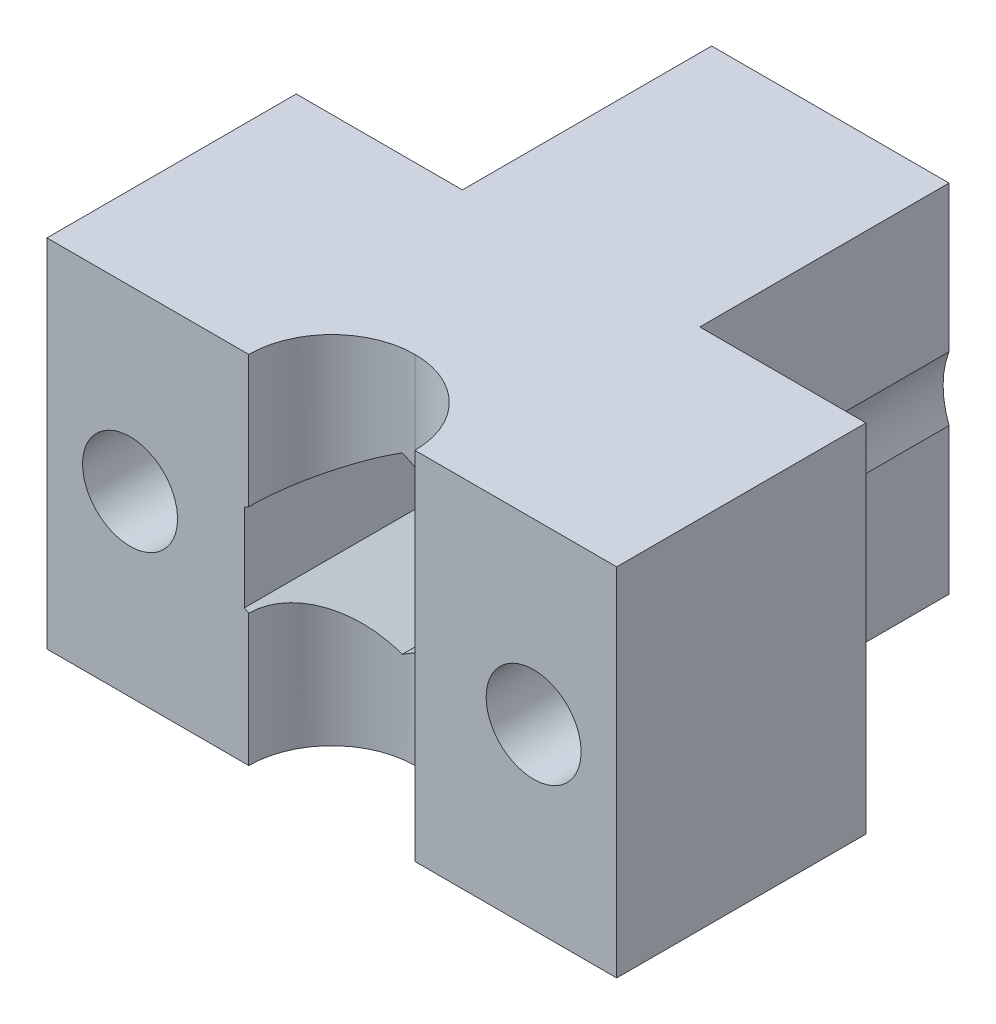
ISO-10303-21;
HEADER;
FILE_DESCRIPTION(('STEP AP214'),'2;1');
FILE_NAME('part.step','',(''),(''),'','','');
FILE_SCHEMA(('AUTOMOTIVE_DESIGN { 1 0 10303 214 1 1 1 1 }'));
ENDSEC;
DATA;
#1=APPLICATION_CONTEXT('core data for automotive mechanical design processes');
#2=APPLICATION_PROTOCOL_DEFINITION('international standard','automotive_design',2000,#1);
#3=PRODUCT_CONTEXT('',#1,'mechanical');
#4=PRODUCT('Part','Part','',(#3));
#5=PRODUCT_RELATED_PRODUCT_CATEGORY('part','',(#4));
#6=PRODUCT_DEFINITION_FORMATION('','',#4);
#7=PRODUCT_DEFINITION_CONTEXT('part definition',#1,'design');
#8=PRODUCT_DEFINITION('design','',#6,#7);
#9=PRODUCT_DEFINITION_SHAPE('','',#8);
#10=(LENGTH_UNIT() NAMED_UNIT(*) SI_UNIT(.MILLI.,.METRE.));
#11=(NAMED_UNIT(*) PLANE_ANGLE_UNIT() SI_UNIT($,.RADIAN.));
#12=(NAMED_UNIT(*) SI_UNIT($,.STERADIAN.) SOLID_ANGLE_UNIT());
#13=UNCERTAINTY_MEASURE_WITH_UNIT(LENGTH_MEASURE(1.E-05),#10,'distance_accuracy_value','');
#14=(GEOMETRIC_REPRESENTATION_CONTEXT(3) GLOBAL_UNCERTAINTY_ASSIGNED_CONTEXT((#13)) GLOBAL_UNIT_ASSIGNED_CONTEXT((#10,
#11,#12)) REPRESENTATION_CONTEXT('',''));
#15=CARTESIAN_POINT('',(0.,0.,0.));
#16=DIRECTION('',(0.,0.,1.));
#17=DIRECTION('',(1.,0.,0.));
#18=AXIS2_PLACEMENT_3D('',#15,#16,#17);
#19=CARTESIAN_POINT('',(0.,0.,10.));
#20=DIRECTION('',(0.,-1.,0.));
#21=DIRECTION('',(1.,0.,0.));
#22=AXIS2_PLACEMENT_3D('',#19,#20,#21);
#23=CYLINDRICAL_SURFACE('',#22,7.);
#24=CARTESIAN_POINT('',(0.,8.22735026918962,10.));
#25=DIRECTION('',(0.5,-0.866025403784439,0.));
#26=DIRECTION('',(-0.866025403784439,-0.5,0.));
#27=AXIS2_PLACEMENT_3D('',#24,#25,#26);
#28=ELLIPSE('',#27,8.08290376865476,7.);
#29=CARTESIAN_POINT('',(0.,8.22735026918962,3.));
#30=VERTEX_POINT('',#29);
#31=CARTESIAN_POINT('',(-1.,7.65,3.07179676972449));
#32=VERTEX_POINT('',#31);
#33=EDGE_CURVE('E456',#30,#32,#28,.F.);
#34=ORIENTED_EDGE('',*,*,#33,.T.);
#35=CARTESIAN_POINT('',(0.,7.07264973081037,10.));
#36=DIRECTION('',(-0.5,-0.866025403784439,0.));
#37=DIRECTION('',(0.866025403784439,-0.5,0.));
#38=AXIS2_PLACEMENT_3D('',#35,#36,#37);
#39=ELLIPSE('',#38,8.08290376865476,7.);
#40=CARTESIAN_POINT('',(-7.,11.1141016151378,10.));
#41=VERTEX_POINT('',#40);
#42=EDGE_CURVE('E459',#32,#41,#39,.F.);
#43=ORIENTED_EDGE('',*,*,#42,.T.);
#44=DIRECTION('',(0.,-1.,0.));
#45=VECTOR('',#44,1.);
#46=CARTESIAN_POINT('',(-7.00000000000001,30.,10.));
#47=LINE('',#46,#45);
#48=CARTESIAN_POINT('',(-7.,0.,10.));
#49=VERTEX_POINT('',#48);
#50=EDGE_CURVE('E394',#41,#49,#47,.T.);
#51=ORIENTED_EDGE('',*,*,#50,.T.);
#52=CARTESIAN_POINT('',(0.,0.,10.));
#53=DIRECTION('',(0.,-1.,0.));
#54=DIRECTION('',(0.,0.,-1.));
#55=AXIS2_PLACEMENT_3D('',#52,#53,#54);
#56=CIRCLE('',#55,7.);
#57=CARTESIAN_POINT('',(0.,0.,3.));
#58=VERTEX_POINT('',#57);
#59=EDGE_CURVE('E426',#58,#49,#56,.F.);
#60=ORIENTED_EDGE('',*,*,#59,.F.);
#61=DIRECTION('',(0.,1.,0.));
#62=VECTOR('',#61,1.);
#63=CARTESIAN_POINT('',(0.,0.,3.));
#64=LINE('',#63,#62);
#65=EDGE_CURVE('E320',#58,#30,#64,.T.);
#66=ORIENTED_EDGE('',*,*,#65,.T.);
#67=EDGE_LOOP('',(#34,#43,#51,#60,#66));
#68=FACE_BOUND('',#67,.T.);
#69=ADVANCED_FACE('F37',(#68),#23,.F.);
#70=CARTESIAN_POINT('',(-10.,0.,0.));
#71=DIRECTION('',(1.,0.,0.));
#72=DIRECTION('',(0.,0.,-1.));
#73=AXIS2_PLACEMENT_3D('',#70,#71,#72);
#74=PLANE('',#73);
#75=DIRECTION('',(0.,0.,1.));
#76=VECTOR('',#75,1.);
#77=CARTESIAN_POINT('',(-10.,17.6925824035673,-32.));
#78=LINE('',#77,#76);
#79=CARTESIAN_POINT('',(-10.,17.6925824035673,-11.));
#80=VERTEX_POINT('',#79);
#81=CARTESIAN_POINT('',(-10.,17.6925824035673,-16.4));
#82=VERTEX_POINT('',#81);
#83=EDGE_CURVE('E450',#80,#82,#78,.F.);
#84=ORIENTED_EDGE('',*,*,#83,.F.);
#85=DIRECTION('',(0.,1.,0.));
#86=VECTOR('',#85,1.);
#87=CARTESIAN_POINT('',(-10.,0.,-11.));
#88=LINE('',#87,#86);
#89=CARTESIAN_POINT('',(-10.,30.,-11.));
#90=VERTEX_POINT('',#89);
#91=EDGE_CURVE('E354',#80,#90,#88,.T.);
#92=ORIENTED_EDGE('',*,*,#91,.T.);
#93=DIRECTION('',(0.,0.,-1.));
#94=VECTOR('',#93,1.);
#95=CARTESIAN_POINT('',(-10.,30.,-11.));
#96=LINE('',#95,#94);
#97=CARTESIAN_POINT('',(-10.,30.,-32.));
#98=VERTEX_POINT('',#97);
#99=EDGE_CURVE('E358',#90,#98,#96,.T.);
#100=ORIENTED_EDGE('',*,*,#99,.T.);
#101=DIRECTION('',(0.,-1.,0.));
#102=VECTOR('',#101,1.);
#103=CARTESIAN_POINT('',(-10.,0.,-32.));
#104=LINE('',#103,#102);
#105=CARTESIAN_POINT('',(-10.,17.6925824035673,-32.));
#106=VERTEX_POINT('',#105);
#107=EDGE_CURVE('E361',#98,#106,#104,.T.);
#108=ORIENTED_EDGE('',*,*,#107,.T.);
#109=CARTESIAN_POINT('',(-10.,17.6925824035673,-26.6));
#110=VERTEX_POINT('',#109);
#111=EDGE_CURVE('E448',#110,#106,#78,.F.);
#112=ORIENTED_EDGE('',*,*,#111,.F.);
#113=DIRECTION('',(0.,-1.,0.));
#114=VECTOR('',#113,1.);
#115=CARTESIAN_POINT('',(-10.,4.9,-26.6));
#116=LINE('',#115,#114);
#117=CARTESIAN_POINT('',(-10.,25.1,-26.6));
#118=VERTEX_POINT('',#117);
#119=EDGE_CURVE('E337',#118,#110,#116,.T.);
#120=ORIENTED_EDGE('',*,*,#119,.F.);
#121=DIRECTION('',(0.,0.,-1.));
#122=VECTOR('',#121,1.);
#123=CARTESIAN_POINT('',(-10.,25.1,-16.4));
#124=LINE('',#123,#122);
#125=CARTESIAN_POINT('',(-10.,25.1,-16.4));
#126=VERTEX_POINT('',#125);
#127=EDGE_CURVE('E333',#126,#118,#124,.T.);
#128=ORIENTED_EDGE('',*,*,#127,.F.);
#129=DIRECTION('',(0.,1.,0.));
#130=VECTOR('',#129,1.);
#131=CARTESIAN_POINT('',(-10.,4.9,-16.4));
#132=LINE('',#131,#130);
#133=EDGE_CURVE('E329',#82,#126,#132,.T.);
#134=ORIENTED_EDGE('',*,*,#133,.F.);
#135=EDGE_LOOP('',(#84,#92,#100,#108,#112,#120,#128,#134));
#136=FACE_BOUND('',#135,.T.);
#137=ADVANCED_FACE('F521',(#136),#74,.F.);
#138=DIRECTION('',(0.,0.,1.));
#139=VECTOR('',#138,1.);
#140=CARTESIAN_POINT('',(-10.,12.3074175964327,-32.));
#141=LINE('',#140,#139);
#142=CARTESIAN_POINT('',(-10.,12.3074175964327,-32.));
#143=VERTEX_POINT('',#142);
#144=CARTESIAN_POINT('',(-10.,12.3074175964327,-26.6));
#145=VERTEX_POINT('',#144);
#146=EDGE_CURVE('E447',#143,#145,#141,.T.);
#147=ORIENTED_EDGE('',*,*,#146,.F.);
#148=CARTESIAN_POINT('',(-10.,0.,-32.));
#149=VERTEX_POINT('',#148);
#150=EDGE_CURVE('E360',#143,#149,#104,.T.);
#151=ORIENTED_EDGE('',*,*,#150,.T.);
#152=DIRECTION('',(0.,0.,1.));
#153=VECTOR('',#152,1.);
#154=CARTESIAN_POINT('',(-10.,0.,-11.));
#155=LINE('',#154,#153);
#156=CARTESIAN_POINT('',(-10.,0.,-11.));
#157=VERTEX_POINT('',#156);
#158=EDGE_CURVE('E351',#149,#157,#155,.T.);
#159=ORIENTED_EDGE('',*,*,#158,.T.);
#160=CARTESIAN_POINT('',(-10.,12.3074175964327,-11.));
#161=VERTEX_POINT('',#160);
#162=EDGE_CURVE('E355',#157,#161,#88,.T.);
#163=ORIENTED_EDGE('',*,*,#162,.T.);
#164=CARTESIAN_POINT('',(-10.,12.3074175964327,-16.4));
#165=VERTEX_POINT('',#164);
#166=EDGE_CURVE('E444',#165,#161,#141,.T.);
#167=ORIENTED_EDGE('',*,*,#166,.F.);
#168=CARTESIAN_POINT('',(-10.,4.9,-16.4));
#169=VERTEX_POINT('',#168);
#170=EDGE_CURVE('E330',#169,#165,#132,.T.);
#171=ORIENTED_EDGE('',*,*,#170,.F.);
#172=DIRECTION('',(0.,0.,1.));
#173=VECTOR('',#172,1.);
#174=CARTESIAN_POINT('',(-10.,4.9,-16.4));
#175=LINE('',#174,#173);
#176=CARTESIAN_POINT('',(-10.,4.9,-26.6));
#177=VERTEX_POINT('',#176);
#178=EDGE_CURVE('E324',#177,#169,#175,.T.);
#179=ORIENTED_EDGE('',*,*,#178,.F.);
#180=EDGE_CURVE('E336',#145,#177,#116,.T.);
#181=ORIENTED_EDGE('',*,*,#180,.F.);
#182=EDGE_LOOP('',(#147,#151,#159,#163,#167,#171,#179,#181));
#183=FACE_BOUND('',#182,.T.);
#184=ADVANCED_FACE('F525',(#183),#74,.F.);
#185=CARTESIAN_POINT('',(10.,0.,0.));
#186=DIRECTION('',(1.,0.,0.));
#187=DIRECTION('',(0.,0.,-1.));
#188=AXIS2_PLACEMENT_3D('',#185,#186,#187);
#189=PLANE('',#188);
#190=DIRECTION('',(0.,-1.,0.));
#191=VECTOR('',#190,1.);
#192=CARTESIAN_POINT('',(10.,0.,-11.));
#193=LINE('',#192,#191);
#194=CARTESIAN_POINT('',(10.,30.,-11.));
#195=VERTEX_POINT('',#194);
#196=CARTESIAN_POINT('',(10.,17.6925824035672,-11.));
#197=VERTEX_POINT('',#196);
#198=EDGE_CURVE('E381',#195,#197,#193,.T.);
#199=ORIENTED_EDGE('',*,*,#198,.T.);
#200=DIRECTION('',(0.,0.,1.));
#201=VECTOR('',#200,1.);
#202=CARTESIAN_POINT('',(10.,17.6925824035672,-32.));
#203=LINE('',#202,#201);
#204=CARTESIAN_POINT('',(10.,17.6925824035672,-32.));
#205=VERTEX_POINT('',#204);
#206=EDGE_CURVE('E441',#197,#205,#203,.F.);
#207=ORIENTED_EDGE('',*,*,#206,.T.);
#208=DIRECTION('',(0.,1.,0.));
#209=VECTOR('',#208,1.);
#210=CARTESIAN_POINT('',(10.,0.,-32.));
#211=LINE('',#210,#209);
#212=CARTESIAN_POINT('',(10.,30.,-32.));
#213=VERTEX_POINT('',#212);
#214=EDGE_CURVE('E374',#205,#213,#211,.T.);
#215=ORIENTED_EDGE('',*,*,#214,.T.);
#216=DIRECTION('',(0.,0.,1.));
#217=VECTOR('',#216,1.);
#218=CARTESIAN_POINT('',(10.,30.,-11.));
#219=LINE('',#218,#217);
#220=EDGE_CURVE('E378',#213,#195,#219,.T.);
#221=ORIENTED_EDGE('',*,*,#220,.T.);
#222=EDGE_LOOP('',(#199,#207,#215,#221));
#223=FACE_BOUND('',#222,.T.);
#224=ADVANCED_FACE('F577',(#223),#189,.T.);
#225=CARTESIAN_POINT('',(10.,0.,-32.));
#226=VERTEX_POINT('',#225);
#227=CARTESIAN_POINT('',(10.,12.3074175964328,-32.));
#228=VERTEX_POINT('',#227);
#229=EDGE_CURVE('E375',#226,#228,#211,.T.);
#230=ORIENTED_EDGE('',*,*,#229,.T.);
#231=DIRECTION('',(0.,0.,1.));
#232=VECTOR('',#231,1.);
#233=CARTESIAN_POINT('',(10.,12.3074175964328,-32.));
#234=LINE('',#233,#232);
#235=CARTESIAN_POINT('',(10.,12.3074175964328,-11.));
#236=VERTEX_POINT('',#235);
#237=EDGE_CURVE('E436',#228,#236,#234,.T.);
#238=ORIENTED_EDGE('',*,*,#237,.T.);
#239=CARTESIAN_POINT('',(10.,0.,-11.));
#240=VERTEX_POINT('',#239);
#241=EDGE_CURVE('E380',#236,#240,#193,.T.);
#242=ORIENTED_EDGE('',*,*,#241,.T.);
#243=DIRECTION('',(0.,0.,-1.));
#244=VECTOR('',#243,1.);
#245=CARTESIAN_POINT('',(10.,0.,-11.));
#246=LINE('',#245,#244);
#247=EDGE_CURVE('E371',#240,#226,#246,.T.);
#248=ORIENTED_EDGE('',*,*,#247,.T.);
#249=EDGE_LOOP('',(#230,#238,#242,#248));
#250=FACE_BOUND('',#249,.T.);
#251=ADVANCED_FACE('F570',(#250),#189,.T.);
#252=CARTESIAN_POINT('',(24.,4.9,-16.4));
#253=DIRECTION('',(0.,-1.,0.));
#254=DIRECTION('',(0.,0.,-1.));
#255=AXIS2_PLACEMENT_3D('',#252,#253,#254);
#256=PLANE('',#255);
#257=DIRECTION('',(0.,0.,-1.));
#258=VECTOR('',#257,1.);
#259=CARTESIAN_POINT('',(6.,4.9,-26.6));
#260=LINE('',#259,#258);
#261=CARTESIAN_POINT('',(6.,4.9,-16.4));
#262=VERTEX_POINT('',#261);
#263=CARTESIAN_POINT('',(6.,4.9,-26.6));
#264=VERTEX_POINT('',#263);
#265=EDGE_CURVE('E305',#262,#264,#260,.T.);
#266=ORIENTED_EDGE('',*,*,#265,.T.);
#267=DIRECTION('',(-1.,0.,0.));
#268=VECTOR('',#267,1.);
#269=CARTESIAN_POINT('',(24.,4.9,-26.6));
#270=LINE('',#269,#268);
#271=EDGE_CURVE('E341',#264,#177,#270,.T.);
#272=ORIENTED_EDGE('',*,*,#271,.T.);
#273=ORIENTED_EDGE('',*,*,#178,.T.);
#274=DIRECTION('',(-1.,0.,0.));
#275=VECTOR('',#274,1.);
#276=CARTESIAN_POINT('',(24.,4.9,-16.4));
#277=LINE('',#276,#275);
#278=EDGE_CURVE('E340',#262,#169,#277,.T.);
#279=ORIENTED_EDGE('',*,*,#278,.F.);
#280=EDGE_LOOP('',(#266,#272,#273,#279));
#281=FACE_BOUND('',#280,.T.);
#282=ADVANCED_FACE('F559',(#281),#256,.F.);
#283=CARTESIAN_POINT('',(24.,4.9,-26.6));
#284=DIRECTION('',(0.,0.,-1.));
#285=DIRECTION('',(-1.,0.,0.));
#286=AXIS2_PLACEMENT_3D('',#283,#284,#285);
#287=PLANE('',#286);
#288=CARTESIAN_POINT('',(-1.,15.,-26.6));
#289=DIRECTION('',(0.,0.,-1.));
#290=DIRECTION('',(-1.,0.,0.));
#291=AXIS2_PLACEMENT_3D('',#288,#289,#290);
#292=CIRCLE('',#291,4.);
#293=CARTESIAN_POINT('',(-5.,15.,-26.6));
#294=VERTEX_POINT('',#293);
#295=EDGE_CURVE('E289',#294,#294,#292,.T.);
#296=ORIENTED_EDGE('',*,*,#295,.T.);
#297=EDGE_LOOP('',(#296));
#298=FACE_BOUND('',#297,.T.);
#299=CARTESIAN_POINT('',(-17.,15.,-26.6));
#300=DIRECTION('',(0.,0.,-1.));
#301=DIRECTION('',(-1.,0.,0.));
#302=AXIS2_PLACEMENT_3D('',#299,#300,#301);
#303=CIRCLE('',#302,7.5);
#304=EDGE_CURVE('E297',#145,#110,#303,.F.);
#305=ORIENTED_EDGE('',*,*,#304,.F.);
#306=ORIENTED_EDGE('',*,*,#180,.T.);
#307=ORIENTED_EDGE('',*,*,#271,.F.);
#308=DIRECTION('',(0.,1.,0.));
#309=VECTOR('',#308,1.);
#310=CARTESIAN_POINT('',(6.,4.9,-26.6));
#311=LINE('',#310,#309);
#312=CARTESIAN_POINT('',(6.,25.1,-26.6));
#313=VERTEX_POINT('',#312);
#314=EDGE_CURVE('E307',#264,#313,#311,.T.);
#315=ORIENTED_EDGE('',*,*,#314,.T.);
#316=DIRECTION('',(-1.,0.,0.));
#317=VECTOR('',#316,1.);
#318=CARTESIAN_POINT('',(24.,25.1,-26.6));
#319=LINE('',#318,#317);
#320=EDGE_CURVE('E345',#313,#118,#319,.T.);
#321=ORIENTED_EDGE('',*,*,#320,.T.);
#322=ORIENTED_EDGE('',*,*,#119,.T.);
#323=EDGE_LOOP('',(#305,#306,#307,#315,#321,#322));
#324=FACE_BOUND('',#323,.T.);
#325=ADVANCED_FACE('F555',(#298,#324),#287,.F.);
#326=CARTESIAN_POINT('',(24.,25.1,-16.4));
#327=DIRECTION('',(0.,1.,0.));
#328=DIRECTION('',(0.,0.,1.));
#329=AXIS2_PLACEMENT_3D('',#326,#327,#328);
#330=PLANE('',#329);
#331=DIRECTION('',(0.,0.,1.));
#332=VECTOR('',#331,1.);
#333=CARTESIAN_POINT('',(6.,25.1,-26.6));
#334=LINE('',#333,#332);
#335=CARTESIAN_POINT('',(6.,25.1,-16.4));
#336=VERTEX_POINT('',#335);
#337=EDGE_CURVE('E309',#313,#336,#334,.T.);
#338=ORIENTED_EDGE('',*,*,#337,.T.);
#339=DIRECTION('',(-1.,0.,0.));
#340=VECTOR('',#339,1.);
#341=CARTESIAN_POINT('',(24.,25.1,-16.4));
#342=LINE('',#341,#340);
#343=EDGE_CURVE('E347',#336,#126,#342,.T.);
#344=ORIENTED_EDGE('',*,*,#343,.T.);
#345=ORIENTED_EDGE('',*,*,#127,.T.);
#346=ORIENTED_EDGE('',*,*,#320,.F.);
#347=EDGE_LOOP('',(#338,#344,#345,#346));
#348=FACE_BOUND('',#347,.T.);
#349=ADVANCED_FACE('F558',(#348),#330,.F.);
#350=CARTESIAN_POINT('',(24.,4.9,-16.4));
#351=DIRECTION('',(0.,0.,1.));
#352=DIRECTION('',(1.,0.,0.));
#353=AXIS2_PLACEMENT_3D('',#350,#351,#352);
#354=PLANE('',#353);
#355=CARTESIAN_POINT('',(-1.,15.,-16.4));
#356=DIRECTION('',(0.,0.,1.));
#357=DIRECTION('',(1.,0.,0.));
#358=AXIS2_PLACEMENT_3D('',#355,#356,#357);
#359=CIRCLE('',#358,4.);
#360=CARTESIAN_POINT('',(3.,15.,-16.4));
#361=VERTEX_POINT('',#360);
#362=EDGE_CURVE('E286',#361,#361,#359,.T.);
#363=ORIENTED_EDGE('',*,*,#362,.T.);
#364=EDGE_LOOP('',(#363));
#365=FACE_BOUND('',#364,.T.);
#366=CARTESIAN_POINT('',(-17.,15.,-16.4));
#367=DIRECTION('',(0.,0.,1.));
#368=DIRECTION('',(1.,0.,0.));
#369=AXIS2_PLACEMENT_3D('',#366,#367,#368);
#370=CIRCLE('',#369,7.5);
#371=EDGE_CURVE('E294',#82,#165,#370,.F.);
#372=ORIENTED_EDGE('',*,*,#371,.F.);
#373=ORIENTED_EDGE('',*,*,#133,.T.);
#374=ORIENTED_EDGE('',*,*,#343,.F.);
#375=DIRECTION('',(0.,-1.,0.));
#376=VECTOR('',#375,1.);
#377=CARTESIAN_POINT('',(6.,4.9,-16.4));
#378=LINE('',#377,#376);
#379=EDGE_CURVE('E302',#336,#262,#378,.T.);
#380=ORIENTED_EDGE('',*,*,#379,.T.);
#381=ORIENTED_EDGE('',*,*,#278,.T.);
#382=ORIENTED_EDGE('',*,*,#170,.T.);
#383=EDGE_LOOP('',(#372,#373,#374,#380,#381,#382));
#384=FACE_BOUND('',#383,.T.);
#385=ADVANCED_FACE('F563',(#365,#384),#354,.F.);
#386=CARTESIAN_POINT('',(-24.,0.,-32.));
#387=DIRECTION('',(0.,0.,1.));
#388=DIRECTION('',(1.,0.,0.));
#389=AXIS2_PLACEMENT_3D('',#386,#387,#388);
#390=PLANE('',#389);
#391=CARTESIAN_POINT('',(-1.,15.,-32.));
#392=DIRECTION('',(0.,0.,-1.));
#393=DIRECTION('',(-1.,0.,0.));
#394=AXIS2_PLACEMENT_3D('',#391,#392,#393);
#395=CIRCLE('',#394,4.);
#396=CARTESIAN_POINT('',(-5.,15.,-32.));
#397=VERTEX_POINT('',#396);
#398=EDGE_CURVE('E283',#397,#397,#395,.T.);
#399=ORIENTED_EDGE('',*,*,#398,.F.);
#400=EDGE_LOOP('',(#399));
#401=FACE_BOUND('',#400,.T.);
#402=CARTESIAN_POINT('',(-17.,15.,-32.));
#403=DIRECTION('',(0.,0.,-1.));
#404=DIRECTION('',(-1.,0.,0.));
#405=AXIS2_PLACEMENT_3D('',#402,#403,#404);
#406=CIRCLE('',#405,7.5);
#407=EDGE_CURVE('E60',#106,#143,#406,.T.);
#408=ORIENTED_EDGE('',*,*,#407,.F.);
#409=ORIENTED_EDGE('',*,*,#107,.F.);
#410=DIRECTION('',(1.,0.,0.));
#411=VECTOR('',#410,1.);
#412=CARTESIAN_POINT('',(-24.,30.,-32.));
#413=LINE('',#412,#411);
#414=EDGE_CURVE('E391',#98,#213,#413,.T.);
#415=ORIENTED_EDGE('',*,*,#414,.T.);
#416=ORIENTED_EDGE('',*,*,#214,.F.);
#417=CARTESIAN_POINT('',(17.,15.,-32.));
#418=DIRECTION('',(0.,0.,-1.));
#419=DIRECTION('',(-1.,0.,0.));
#420=AXIS2_PLACEMENT_3D('',#417,#418,#419);
#421=CIRCLE('',#420,7.5);
#422=EDGE_CURVE('E300',#228,#205,#421,.T.);
#423=ORIENTED_EDGE('',*,*,#422,.F.);
#424=ORIENTED_EDGE('',*,*,#229,.F.);
#425=DIRECTION('',(1.,0.,0.));
#426=VECTOR('',#425,1.);
#427=CARTESIAN_POINT('',(-24.,0.,-32.));
#428=LINE('',#427,#426);
#429=EDGE_CURVE('E389',#149,#226,#428,.T.);
#430=ORIENTED_EDGE('',*,*,#429,.F.);
#431=ORIENTED_EDGE('',*,*,#150,.F.);
#432=EDGE_LOOP('',(#408,#409,#415,#416,#423,#424,#430,#431));
#433=FACE_BOUND('',#432,.T.);
#434=ADVANCED_FACE('F567',(#401,#433),#390,.F.);
#435=CARTESIAN_POINT('',(-24.,30.,10.));
#436=DIRECTION('',(0.,0.,-1.));
#437=DIRECTION('',(-1.,0.,0.));
#438=AXIS2_PLACEMENT_3D('',#435,#436,#437);
#439=PLANE('',#438);
#440=CARTESIAN_POINT('',(17.,15.,10.));
#441=DIRECTION('',(0.,0.,-1.));
#442=DIRECTION('',(-1.,0.,0.));
#443=AXIS2_PLACEMENT_3D('',#440,#441,#442);
#444=CIRCLE('',#443,4.);
#445=CARTESIAN_POINT('',(13.,15.,10.));
#446=VERTEX_POINT('',#445);
#447=EDGE_CURVE('E313',#446,#446,#444,.T.);
#448=ORIENTED_EDGE('',*,*,#447,.T.);
#449=EDGE_LOOP('',(#448));
#450=FACE_BOUND('',#449,.T.);
#451=DIRECTION('',(1.,0.,0.));
#452=VECTOR('',#451,1.);
#453=CARTESIAN_POINT('',(-24.,30.,10.));
#454=LINE('',#453,#452);
#455=CARTESIAN_POINT('',(7.,30.,10.));
#456=VERTEX_POINT('',#455);
#457=CARTESIAN_POINT('',(24.,30.,10.));
#458=VERTEX_POINT('',#457);
#459=EDGE_CURVE('E409',#456,#458,#454,.T.);
#460=ORIENTED_EDGE('',*,*,#459,.F.);
#461=DIRECTION('',(0.,1.,0.));
#462=VECTOR('',#461,1.);
#463=CARTESIAN_POINT('',(7.,0.,10.));
#464=LINE('',#463,#462);
#465=CARTESIAN_POINT('',(7.,0.,10.));
#466=VERTEX_POINT('',#465);
#467=EDGE_CURVE('E399',#466,#456,#464,.T.);
#468=ORIENTED_EDGE('',*,*,#467,.F.);
#469=DIRECTION('',(1.,0.,0.));
#470=VECTOR('',#469,1.);
#471=CARTESIAN_POINT('',(-24.,0.,10.));
#472=LINE('',#471,#470);
#473=CARTESIAN_POINT('',(24.,0.,10.));
#474=VERTEX_POINT('',#473);
#475=EDGE_CURVE('E418',#466,#474,#472,.T.);
#476=ORIENTED_EDGE('',*,*,#475,.T.);
#477=DIRECTION('',(0.,-1.,0.));
#478=VECTOR('',#477,1.);
#479=CARTESIAN_POINT('',(24.,30.,10.));
#480=LINE('',#479,#478);
#481=EDGE_CURVE('E413',#458,#474,#480,.T.);
#482=ORIENTED_EDGE('',*,*,#481,.F.);
#483=EDGE_LOOP('',(#460,#468,#476,#482));
#484=FACE_BOUND('',#483,.T.);
#485=ADVANCED_FACE('F489',(#450,#484),#439,.F.);
#486=CARTESIAN_POINT('',(24.,30.,10.));
#487=DIRECTION('',(-1.,0.,0.));
#488=DIRECTION('',(0.,0.,1.));
#489=AXIS2_PLACEMENT_3D('',#486,#487,#488);
#490=PLANE('',#489);
#491=DIRECTION('',(0.,0.,-1.));
#492=VECTOR('',#491,1.);
#493=CARTESIAN_POINT('',(24.,0.,10.));
#494=LINE('',#493,#492);
#495=CARTESIAN_POINT('',(24.,0.,-11.));
#496=VERTEX_POINT('',#495);
#497=EDGE_CURVE('E402',#474,#496,#494,.T.);
#498=ORIENTED_EDGE('',*,*,#497,.T.);
#499=DIRECTION('',(0.,-1.,0.));
#500=VECTOR('',#499,1.);
#501=CARTESIAN_POINT('',(24.,0.,-11.));
#502=LINE('',#501,#500);
#503=CARTESIAN_POINT('',(24.,30.,-11.));
#504=VERTEX_POINT('',#503);
#505=EDGE_CURVE('E369',#504,#496,#502,.T.);
#506=ORIENTED_EDGE('',*,*,#505,.F.);
#507=DIRECTION('',(0.,0.,-1.));
#508=VECTOR('',#507,1.);
#509=CARTESIAN_POINT('',(24.,30.,10.));
#510=LINE('',#509,#508);
#511=EDGE_CURVE('E403',#458,#504,#510,.T.);
#512=ORIENTED_EDGE('',*,*,#511,.F.);
#513=ORIENTED_EDGE('',*,*,#481,.T.);
#514=EDGE_LOOP('',(#498,#506,#512,#513));
#515=FACE_BOUND('',#514,.T.);
#516=ADVANCED_FACE('F492',(#515),#490,.F.);
#517=CARTESIAN_POINT('',(-24.,30.,10.));
#518=DIRECTION('',(1.,0.,0.));
#519=DIRECTION('',(0.,0.,-1.));
#520=AXIS2_PLACEMENT_3D('',#517,#518,#519);
#521=PLANE('',#520);
#522=DIRECTION('',(0.,0.,1.));
#523=VECTOR('',#522,1.);
#524=CARTESIAN_POINT('',(-24.,30.,10.));
#525=LINE('',#524,#523);
#526=CARTESIAN_POINT('',(-24.,30.,-11.));
#527=VERTEX_POINT('',#526);
#528=CARTESIAN_POINT('',(-24.,30.,10.));
#529=VERTEX_POINT('',#528);
#530=EDGE_CURVE('E406',#527,#529,#525,.T.);
#531=ORIENTED_EDGE('',*,*,#530,.F.);
#532=DIRECTION('',(0.,1.,0.));
#533=VECTOR('',#532,1.);
#534=CARTESIAN_POINT('',(-24.,0.,-11.));
#535=LINE('',#534,#533);
#536=CARTESIAN_POINT('',(-24.,0.,-11.));
#537=VERTEX_POINT('',#536);
#538=EDGE_CURVE('E344',#537,#527,#535,.T.);
#539=ORIENTED_EDGE('',*,*,#538,.F.);
#540=DIRECTION('',(0.,0.,1.));
#541=VECTOR('',#540,1.);
#542=CARTESIAN_POINT('',(-24.,0.,10.));
#543=LINE('',#542,#541);
#544=CARTESIAN_POINT('',(-24.,0.,10.));
#545=VERTEX_POINT('',#544);
#546=EDGE_CURVE('E416',#537,#545,#543,.T.);
#547=ORIENTED_EDGE('',*,*,#546,.T.);
#548=DIRECTION('',(0.,-1.,0.));
#549=VECTOR('',#548,1.);
#550=CARTESIAN_POINT('',(-24.,30.,10.));
#551=LINE('',#550,#549);
#552=EDGE_CURVE('E423',#529,#545,#551,.T.);
#553=ORIENTED_EDGE('',*,*,#552,.F.);
#554=EDGE_LOOP('',(#531,#539,#547,#553));
#555=FACE_BOUND('',#554,.T.);
#556=ADVANCED_FACE('F593',(#555),#521,.F.);
#557=CARTESIAN_POINT('',(-17.,15.,10.));
#558=DIRECTION('',(0.,0.,-1.));
#559=DIRECTION('',(-1.,0.,0.));
#560=AXIS2_PLACEMENT_3D('',#557,#558,#559);
#561=CIRCLE('',#560,4.);
#562=CARTESIAN_POINT('',(-21.,15.,10.));
#563=VERTEX_POINT('',#562);
#564=EDGE_CURVE('E321',#563,#563,#561,.T.);
#565=ORIENTED_EDGE('',*,*,#564,.T.);
#566=EDGE_LOOP('',(#565));
#567=FACE_BOUND('',#566,.T.);
#568=DIRECTION('',(0.,1.,0.));
#569=VECTOR('',#568,1.);
#570=CARTESIAN_POINT('',(-7.36528671781563,30.,10.));
#571=LINE('',#570,#569);
#572=CARTESIAN_POINT('',(-7.36528671781562,11.325,10.));
#573=VERTEX_POINT('',#572);
#574=CARTESIAN_POINT('',(-7.36528671781563,18.675,10.));
#575=VERTEX_POINT('',#574);
#576=EDGE_CURVE('E11',#573,#575,#571,.T.);
#577=ORIENTED_EDGE('',*,*,#576,.T.);
#578=DIRECTION('',(0.866025403784439,0.5,0.));
#579=VECTOR('',#578,1.);
#580=CARTESIAN_POINT('',(-14.9374528305245,14.303207856479,10.));
#581=LINE('',#580,#579);
#582=CARTESIAN_POINT('',(-7.,18.8858983848622,10.));
#583=VERTEX_POINT('',#582);
#584=EDGE_CURVE('E280',#575,#583,#581,.T.);
#585=ORIENTED_EDGE('',*,*,#584,.T.);
#586=CARTESIAN_POINT('',(-7.00000000000001,30.,10.));
#587=VERTEX_POINT('',#586);
#588=EDGE_CURVE('E396',#587,#583,#47,.T.);
#589=ORIENTED_EDGE('',*,*,#588,.F.);
#590=EDGE_CURVE('E410',#529,#587,#454,.T.);
#591=ORIENTED_EDGE('',*,*,#590,.F.);
#592=ORIENTED_EDGE('',*,*,#552,.T.);
#593=EDGE_CURVE('E407',#545,#49,#472,.T.);
#594=ORIENTED_EDGE('',*,*,#593,.T.);
#595=ORIENTED_EDGE('',*,*,#50,.F.);
#596=DIRECTION('',(-0.866025403784439,0.5,0.));
#597=VECTOR('',#596,1.);
#598=CARTESIAN_POINT('',(-27.9278338872911,23.196792143521,10.));
#599=LINE('',#598,#597);
#600=EDGE_CURVE('E277',#41,#573,#599,.T.);
#601=ORIENTED_EDGE('',*,*,#600,.T.);
#602=EDGE_LOOP('',(#577,#585,#589,#591,#592,#594,#595,#601));
#603=FACE_BOUND('',#602,.T.);
#604=ADVANCED_FACE('F503',(#567,#603),#439,.F.);
#605=CARTESIAN_POINT('',(0.,30.,0.));
#606=DIRECTION('',(0.,-1.,0.));
#607=DIRECTION('',(0.,0.,-1.));
#608=AXIS2_PLACEMENT_3D('',#605,#606,#607);
#609=PLANE('',#608);
#610=ORIENTED_EDGE('',*,*,#99,.F.);
#611=DIRECTION('',(-1.,0.,0.));
#612=VECTOR('',#611,1.);
#613=CARTESIAN_POINT('',(-10.,30.,-11.));
#614=LINE('',#613,#612);
#615=EDGE_CURVE('E366',#90,#527,#614,.T.);
#616=ORIENTED_EDGE('',*,*,#615,.T.);
#617=ORIENTED_EDGE('',*,*,#530,.T.);
#618=ORIENTED_EDGE('',*,*,#590,.T.);
#619=CARTESIAN_POINT('',(0.,30.,10.));
#620=DIRECTION('',(0.,-1.,0.));
#621=DIRECTION('',(0.,0.,-1.));
#622=AXIS2_PLACEMENT_3D('',#619,#620,#621);
#623=CIRCLE('',#622,7.);
#624=CARTESIAN_POINT('',(0.,30.,3.));
#625=VERTEX_POINT('',#624);
#626=EDGE_CURVE('E429',#587,#625,#623,.T.);
#627=ORIENTED_EDGE('',*,*,#626,.T.);
#628=CARTESIAN_POINT('',(0.,30.,10.));
#629=DIRECTION('',(0.,-1.,0.));
#630=DIRECTION('',(0.,0.,-1.));
#631=AXIS2_PLACEMENT_3D('',#628,#629,#630);
#632=CIRCLE('',#631,7.);
#633=EDGE_CURVE('E432',#625,#456,#632,.T.);
#634=ORIENTED_EDGE('',*,*,#633,.T.);
#635=ORIENTED_EDGE('',*,*,#459,.T.);
#636=ORIENTED_EDGE('',*,*,#511,.T.);
#637=DIRECTION('',(1.,0.,0.));
#638=VECTOR('',#637,1.);
#639=CARTESIAN_POINT('',(10.,30.,-11.));
#640=LINE('',#639,#638);
#641=EDGE_CURVE('E384',#195,#504,#640,.T.);
#642=ORIENTED_EDGE('',*,*,#641,.F.);
#643=ORIENTED_EDGE('',*,*,#220,.F.);
#644=ORIENTED_EDGE('',*,*,#414,.F.);
#645=EDGE_LOOP('',(#610,#616,#617,#618,#627,#634,#635,#636,#642,#643,#644));
#646=FACE_BOUND('',#645,.T.);
#647=ADVANCED_FACE('F497',(#646),#609,.F.);
#648=CARTESIAN_POINT('',(0.,0.,0.));
#649=DIRECTION('',(0.,-1.,0.));
#650=DIRECTION('',(0.,0.,-1.));
#651=AXIS2_PLACEMENT_3D('',#648,#649,#650);
#652=PLANE('',#651);
#653=DIRECTION('',(-1.,0.,0.));
#654=VECTOR('',#653,1.);
#655=CARTESIAN_POINT('',(-10.,0.,-11.));
#656=LINE('',#655,#654);
#657=EDGE_CURVE('E364',#157,#537,#656,.T.);
#658=ORIENTED_EDGE('',*,*,#657,.F.);
#659=ORIENTED_EDGE('',*,*,#158,.F.);
#660=ORIENTED_EDGE('',*,*,#429,.T.);
#661=ORIENTED_EDGE('',*,*,#247,.F.);
#662=DIRECTION('',(1.,0.,0.));
#663=VECTOR('',#662,1.);
#664=CARTESIAN_POINT('',(10.,0.,-11.));
#665=LINE('',#664,#663);
#666=EDGE_CURVE('E386',#240,#496,#665,.T.);
#667=ORIENTED_EDGE('',*,*,#666,.T.);
#668=ORIENTED_EDGE('',*,*,#497,.F.);
#669=ORIENTED_EDGE('',*,*,#475,.F.);
#670=CARTESIAN_POINT('',(0.,0.,10.));
#671=DIRECTION('',(0.,-1.,0.));
#672=DIRECTION('',(0.,0.,-1.));
#673=AXIS2_PLACEMENT_3D('',#670,#671,#672);
#674=CIRCLE('',#673,7.);
#675=EDGE_CURVE('E434',#466,#58,#674,.F.);
#676=ORIENTED_EDGE('',*,*,#675,.T.);
#677=ORIENTED_EDGE('',*,*,#59,.T.);
#678=ORIENTED_EDGE('',*,*,#593,.F.);
#679=ORIENTED_EDGE('',*,*,#546,.F.);
#680=EDGE_LOOP('',(#658,#659,#660,#661,#667,#668,#669,#676,#677,#678,#679));
#681=FACE_BOUND('',#680,.T.);
#682=ADVANCED_FACE('F483',(#681),#652,.T.);
#683=CARTESIAN_POINT('',(10.,0.,-11.));
#684=DIRECTION('',(0.,0.,1.));
#685=DIRECTION('',(0.,-1.,0.));
#686=AXIS2_PLACEMENT_3D('',#683,#684,#685);
#687=PLANE('',#686);
#688=ORIENTED_EDGE('',*,*,#241,.F.);
#689=CARTESIAN_POINT('',(17.,15.,-11.));
#690=DIRECTION('',(0.,0.,-1.));
#691=DIRECTION('',(-1.,0.,0.));
#692=AXIS2_PLACEMENT_3D('',#689,#690,#691);
#693=CIRCLE('',#692,7.5);
#694=EDGE_CURVE('E299',#236,#197,#693,.T.);
#695=ORIENTED_EDGE('',*,*,#694,.T.);
#696=ORIENTED_EDGE('',*,*,#198,.F.);
#697=ORIENTED_EDGE('',*,*,#641,.T.);
#698=ORIENTED_EDGE('',*,*,#505,.T.);
#699=ORIENTED_EDGE('',*,*,#666,.F.);
#700=EDGE_LOOP('',(#688,#695,#696,#697,#698,#699));
#701=FACE_BOUND('',#700,.T.);
#702=CARTESIAN_POINT('',(17.,15.,-11.));
#703=DIRECTION('',(0.,0.,-1.));
#704=DIRECTION('',(-1.,0.,0.));
#705=AXIS2_PLACEMENT_3D('',#702,#703,#704);
#706=CIRCLE('',#705,4.);
#707=CARTESIAN_POINT('',(13.,15.,-11.));
#708=VERTEX_POINT('',#707);
#709=EDGE_CURVE('E317',#708,#708,#706,.T.);
#710=ORIENTED_EDGE('',*,*,#709,.F.);
#711=EDGE_LOOP('',(#710));
#712=FACE_BOUND('',#711,.T.);
#713=ADVANCED_FACE('F575',(#701,#712),#687,.F.);
#714=CARTESIAN_POINT('',(-10.,0.,-11.));
#715=DIRECTION('',(0.,0.,1.));
#716=DIRECTION('',(0.,-1.,0.));
#717=AXIS2_PLACEMENT_3D('',#714,#715,#716);
#718=PLANE('',#717);
#719=ORIENTED_EDGE('',*,*,#538,.T.);
#720=ORIENTED_EDGE('',*,*,#615,.F.);
#721=ORIENTED_EDGE('',*,*,#91,.F.);
#722=CARTESIAN_POINT('',(-17.,15.,-11.));
#723=DIRECTION('',(0.,0.,-1.));
#724=DIRECTION('',(-1.,0.,0.));
#725=AXIS2_PLACEMENT_3D('',#722,#723,#724);
#726=CIRCLE('',#725,7.5);
#727=EDGE_CURVE('E292',#80,#161,#726,.T.);
#728=ORIENTED_EDGE('',*,*,#727,.T.);
#729=ORIENTED_EDGE('',*,*,#162,.F.);
#730=ORIENTED_EDGE('',*,*,#657,.T.);
#731=EDGE_LOOP('',(#719,#720,#721,#728,#729,#730));
#732=FACE_BOUND('',#731,.T.);
#733=CARTESIAN_POINT('',(-17.,15.,-11.));
#734=DIRECTION('',(0.,0.,-1.));
#735=DIRECTION('',(-1.,0.,0.));
#736=AXIS2_PLACEMENT_3D('',#733,#734,#735);
#737=CIRCLE('',#736,4.);
#738=CARTESIAN_POINT('',(-21.,15.,-11.));
#739=VERTEX_POINT('',#738);
#740=EDGE_CURVE('E316',#739,#739,#737,.T.);
#741=ORIENTED_EDGE('',*,*,#740,.F.);
#742=EDGE_LOOP('',(#741));
#743=FACE_BOUND('',#742,.T.);
#744=ADVANCED_FACE('F548',(#732,#743),#718,.F.);
#745=CARTESIAN_POINT('',(-17.,15.,10.));
#746=DIRECTION('',(0.,0.,-1.));
#747=DIRECTION('',(-1.,0.,0.));
#748=AXIS2_PLACEMENT_3D('',#745,#746,#747);
#749=CYLINDRICAL_SURFACE('',#748,4.);
#750=ORIENTED_EDGE('',*,*,#564,.F.);
#751=EDGE_LOOP('',(#750));
#752=FACE_BOUND('',#751,.T.);
#753=ORIENTED_EDGE('',*,*,#740,.T.);
#754=EDGE_LOOP('',(#753));
#755=FACE_BOUND('',#754,.T.);
#756=ADVANCED_FACE('F542',(#752,#755),#749,.F.);
#757=CARTESIAN_POINT('',(17.,15.,10.));
#758=DIRECTION('',(0.,0.,-1.));
#759=DIRECTION('',(-1.,0.,0.));
#760=AXIS2_PLACEMENT_3D('',#757,#758,#759);
#761=CYLINDRICAL_SURFACE('',#760,4.);
#762=ORIENTED_EDGE('',*,*,#447,.F.);
#763=EDGE_LOOP('',(#762));
#764=FACE_BOUND('',#763,.T.);
#765=ORIENTED_EDGE('',*,*,#709,.T.);
#766=EDGE_LOOP('',(#765));
#767=FACE_BOUND('',#766,.T.);
#768=ADVANCED_FACE('F538',(#764,#767),#761,.F.);
#769=CARTESIAN_POINT('',(0.,0.,10.));
#770=DIRECTION('',(0.,1.,0.));
#771=DIRECTION('',(0.,0.,1.));
#772=AXIS2_PLACEMENT_3D('',#769,#770,#771);
#773=CYLINDRICAL_SURFACE('',#772,7.);
#774=DIRECTION('',(0.,1.,0.));
#775=VECTOR('',#774,1.);
#776=CARTESIAN_POINT('',(5.36528671781562,0.,5.50403531646085));
#777=LINE('',#776,#775);
#778=CARTESIAN_POINT('',(5.36528671781562,18.675,5.50403531646086));
#779=VERTEX_POINT('',#778);
#780=CARTESIAN_POINT('',(5.36528671781562,11.325,5.50403531646085));
#781=VERTEX_POINT('',#780);
#782=EDGE_CURVE('E45',#779,#781,#777,.F.);
#783=ORIENTED_EDGE('',*,*,#782,.T.);
#784=CARTESIAN_POINT('',(0.,8.22735026918962,10.));
#785=DIRECTION('',(0.5,-0.866025403784439,0.));
#786=DIRECTION('',(0.866025403784439,0.5,0.));
#787=AXIS2_PLACEMENT_3D('',#784,#785,#786);
#788=ELLIPSE('',#787,8.08290376865476,7.);
#789=EDGE_CURVE('E274',#781,#30,#788,.F.);
#790=ORIENTED_EDGE('',*,*,#789,.T.);
#791=ORIENTED_EDGE('',*,*,#65,.F.);
#792=ORIENTED_EDGE('',*,*,#675,.F.);
#793=ORIENTED_EDGE('',*,*,#467,.T.);
#794=ORIENTED_EDGE('',*,*,#633,.F.);
#795=CARTESIAN_POINT('',(0.,21.7726497308104,3.));
#796=VERTEX_POINT('',#795);
#797=EDGE_CURVE('E312',#796,#625,#64,.T.);
#798=ORIENTED_EDGE('',*,*,#797,.F.);
#799=CARTESIAN_POINT('',(0.,21.7726497308104,10.));
#800=DIRECTION('',(0.5,0.866025403784438,0.));
#801=DIRECTION('',(-0.866025403784439,0.5,0.));
#802=AXIS2_PLACEMENT_3D('',#799,#800,#801);
#803=ELLIPSE('',#802,8.08290376865476,7.);
#804=EDGE_CURVE('E52',#796,#779,#803,.F.);
#805=ORIENTED_EDGE('',*,*,#804,.T.);
#806=EDGE_LOOP('',(#783,#790,#791,#792,#793,#794,#798,#805));
#807=FACE_BOUND('',#806,.T.);
#808=ADVANCED_FACE('F39',(#807),#773,.F.);
#809=ORIENTED_EDGE('',*,*,#588,.T.);
#810=CARTESIAN_POINT('',(0.,22.9273502691896,10.));
#811=DIRECTION('',(-0.5,0.866025403784438,0.));
#812=DIRECTION('',(-0.866025403784439,-0.5,0.));
#813=AXIS2_PLACEMENT_3D('',#810,#811,#812);
#814=ELLIPSE('',#813,8.08290376865476,7.);
#815=CARTESIAN_POINT('',(-1.,22.35,3.07179676972449));
#816=VERTEX_POINT('',#815);
#817=EDGE_CURVE('E454',#583,#816,#814,.F.);
#818=ORIENTED_EDGE('',*,*,#817,.T.);
#819=CARTESIAN_POINT('',(0.,21.7726497308104,10.));
#820=DIRECTION('',(0.5,0.866025403784438,0.));
#821=DIRECTION('',(0.866025403784439,-0.5,0.));
#822=AXIS2_PLACEMENT_3D('',#819,#820,#821);
#823=ELLIPSE('',#822,8.08290376865476,7.);
#824=EDGE_CURVE('E232',#816,#796,#823,.F.);
#825=ORIENTED_EDGE('',*,*,#824,.T.);
#826=ORIENTED_EDGE('',*,*,#797,.T.);
#827=ORIENTED_EDGE('',*,*,#626,.F.);
#828=EDGE_LOOP('',(#809,#818,#825,#826,#827));
#829=FACE_BOUND('',#828,.T.);
#830=ADVANCED_FACE('F500',(#829),#23,.F.);
#831=CARTESIAN_POINT('',(6.,0.,0.));
#832=DIRECTION('',(1.,0.,0.));
#833=DIRECTION('',(0.,0.,-1.));
#834=AXIS2_PLACEMENT_3D('',#831,#832,#833);
#835=PLANE('',#834);
#836=ORIENTED_EDGE('',*,*,#379,.F.);
#837=ORIENTED_EDGE('',*,*,#337,.F.);
#838=ORIENTED_EDGE('',*,*,#314,.F.);
#839=ORIENTED_EDGE('',*,*,#265,.F.);
#840=EDGE_LOOP('',(#836,#837,#838,#839));
#841=FACE_BOUND('',#840,.T.);
#842=ADVANCED_FACE('F530',(#841),#835,.F.);
#843=CARTESIAN_POINT('',(17.,15.,-32.));
#844=DIRECTION('',(0.,0.,1.));
#845=DIRECTION('',(1.,0.,0.));
#846=AXIS2_PLACEMENT_3D('',#843,#844,#845);
#847=CYLINDRICAL_SURFACE('',#846,7.5);
#848=ORIENTED_EDGE('',*,*,#694,.F.);
#849=ORIENTED_EDGE('',*,*,#237,.F.);
#850=ORIENTED_EDGE('',*,*,#422,.T.);
#851=ORIENTED_EDGE('',*,*,#206,.F.);
#852=EDGE_LOOP('',(#848,#849,#850,#851));
#853=FACE_BOUND('',#852,.T.);
#854=ADVANCED_FACE('F535',(#853),#847,.F.);
#855=CARTESIAN_POINT('',(-17.,15.,-32.));
#856=DIRECTION('',(0.,0.,1.));
#857=DIRECTION('',(1.,0.,0.));
#858=AXIS2_PLACEMENT_3D('',#855,#856,#857);
#859=CYLINDRICAL_SURFACE('',#858,7.5);
#860=ORIENTED_EDGE('',*,*,#83,.T.);
#861=ORIENTED_EDGE('',*,*,#371,.T.);
#862=ORIENTED_EDGE('',*,*,#166,.T.);
#863=ORIENTED_EDGE('',*,*,#727,.F.);
#864=EDGE_LOOP('',(#860,#861,#862,#863));
#865=FACE_BOUND('',#864,.T.);
#866=ADVANCED_FACE('F664',(#865),#859,.F.);
#867=ORIENTED_EDGE('',*,*,#111,.T.);
#868=ORIENTED_EDGE('',*,*,#407,.T.);
#869=ORIENTED_EDGE('',*,*,#146,.T.);
#870=ORIENTED_EDGE('',*,*,#304,.T.);
#871=EDGE_LOOP('',(#867,#868,#869,#870));
#872=FACE_BOUND('',#871,.T.);
#873=ADVANCED_FACE('F672',(#872),#859,.F.);
#874=CARTESIAN_POINT('',(-1.,15.,9.99999999999999));
#875=DIRECTION('',(0.,0.,-1.));
#876=DIRECTION('',(-1.,0.,0.));
#877=AXIS2_PLACEMENT_3D('',#874,#875,#876);
#878=CYLINDRICAL_SURFACE('',#877,4.);
#879=CARTESIAN_POINT('',(-1.,15.,-7.));
#880=DIRECTION('',(0.,0.,-1.));
#881=DIRECTION('',(-1.,0.,0.));
#882=AXIS2_PLACEMENT_3D('',#879,#880,#881);
#883=CIRCLE('',#882,4.);
#884=CARTESIAN_POINT('',(-5.,15.,-7.));
#885=VERTEX_POINT('',#884);
#886=EDGE_CURVE('E265',#885,#885,#883,.F.);
#887=ORIENTED_EDGE('',*,*,#886,.T.);
#888=EDGE_LOOP('',(#887));
#889=FACE_BOUND('',#888,.T.);
#890=ORIENTED_EDGE('',*,*,#362,.F.);
#891=EDGE_LOOP('',(#890));
#892=FACE_BOUND('',#891,.T.);
#893=ADVANCED_FACE('F515',(#889,#892),#878,.F.);
#894=ORIENTED_EDGE('',*,*,#398,.T.);
#895=EDGE_LOOP('',(#894));
#896=FACE_BOUND('',#895,.T.);
#897=ORIENTED_EDGE('',*,*,#295,.F.);
#898=EDGE_LOOP('',(#897));
#899=FACE_BOUND('',#898,.T.);
#900=ADVANCED_FACE('F508',(#896,#899),#878,.F.);
#901=CARTESIAN_POINT('',(-7.36528671781562,11.325,13.));
#902=DIRECTION('',(-1.,0.,0.));
#903=DIRECTION('',(0.,-1.,0.));
#904=AXIS2_PLACEMENT_3D('',#901,#902,#903);
#905=PLANE('',#904);
#906=DIRECTION('',(0.,0.,-1.));
#907=VECTOR('',#906,1.);
#908=CARTESIAN_POINT('',(-7.36528671781562,11.325,13.));
#909=LINE('',#908,#907);
#910=CARTESIAN_POINT('',(-7.36528671781562,11.325,-7.));
#911=VERTEX_POINT('',#910);
#912=EDGE_CURVE('E266',#573,#911,#909,.T.);
#913=ORIENTED_EDGE('',*,*,#912,.T.);
#914=DIRECTION('',(0.,1.,0.));
#915=VECTOR('',#914,1.);
#916=CARTESIAN_POINT('',(-7.36528671781562,11.325,-7.));
#917=LINE('',#916,#915);
#918=CARTESIAN_POINT('',(-7.36528671781563,18.675,-7.));
#919=VERTEX_POINT('',#918);
#920=EDGE_CURVE('E237',#911,#919,#917,.T.);
#921=ORIENTED_EDGE('',*,*,#920,.T.);
#922=DIRECTION('',(0.,0.,-1.));
#923=VECTOR('',#922,1.);
#924=CARTESIAN_POINT('',(-7.36528671781563,18.675,13.));
#925=LINE('',#924,#923);
#926=EDGE_CURVE('E253',#575,#919,#925,.T.);
#927=ORIENTED_EDGE('',*,*,#926,.F.);
#928=ORIENTED_EDGE('',*,*,#576,.F.);
#929=EDGE_LOOP('',(#913,#921,#927,#928));
#930=FACE_BOUND('',#929,.T.);
#931=ADVANCED_FACE('F506',(#930),#905,.F.);
#932=CARTESIAN_POINT('',(5.36528671781562,18.675,13.));
#933=DIRECTION('',(1.,0.,0.));
#934=DIRECTION('',(0.,0.,-1.));
#935=AXIS2_PLACEMENT_3D('',#932,#933,#934);
#936=PLANE('',#935);
#937=DIRECTION('',(0.,0.,-1.));
#938=VECTOR('',#937,1.);
#939=CARTESIAN_POINT('',(5.36528671781562,18.675,13.));
#940=LINE('',#939,#938);
#941=CARTESIAN_POINT('',(5.36528671781562,18.675,-7.));
#942=VERTEX_POINT('',#941);
#943=EDGE_CURVE('E236',#779,#942,#940,.T.);
#944=ORIENTED_EDGE('',*,*,#943,.T.);
#945=DIRECTION('',(0.,-1.,0.));
#946=VECTOR('',#945,1.);
#947=CARTESIAN_POINT('',(5.36528671781562,18.675,-7.));
#948=LINE('',#947,#946);
#949=CARTESIAN_POINT('',(5.36528671781562,11.325,-7.));
#950=VERTEX_POINT('',#949);
#951=EDGE_CURVE('E249',#942,#950,#948,.T.);
#952=ORIENTED_EDGE('',*,*,#951,.T.);
#953=DIRECTION('',(0.,0.,-1.));
#954=VECTOR('',#953,1.);
#955=CARTESIAN_POINT('',(5.36528671781562,11.325,13.));
#956=LINE('',#955,#954);
#957=EDGE_CURVE('E270',#781,#950,#956,.T.);
#958=ORIENTED_EDGE('',*,*,#957,.F.);
#959=ORIENTED_EDGE('',*,*,#782,.F.);
#960=EDGE_LOOP('',(#944,#952,#958,#959));
#961=FACE_BOUND('',#960,.T.);
#962=ADVANCED_FACE('F467',(#961),#936,.F.);
#963=CARTESIAN_POINT('',(-7.36528671781563,18.675,13.));
#964=DIRECTION('',(-0.5,0.866025403784438,0.));
#965=DIRECTION('',(-0.866025403784439,-0.5,0.));
#966=AXIS2_PLACEMENT_3D('',#963,#964,#965);
#967=PLANE('',#966);
#968=ORIENTED_EDGE('',*,*,#926,.T.);
#969=DIRECTION('',(0.866025403784439,0.5,0.));
#970=VECTOR('',#969,1.);
#971=CARTESIAN_POINT('',(-7.36528671781563,18.675,-7.));
#972=LINE('',#971,#970);
#973=CARTESIAN_POINT('',(-1.,22.35,-7.));
#974=VERTEX_POINT('',#973);
#975=EDGE_CURVE('E245',#919,#974,#972,.T.);
#976=ORIENTED_EDGE('',*,*,#975,.T.);
#977=DIRECTION('',(0.,0.,-1.));
#978=VECTOR('',#977,1.);
#979=CARTESIAN_POINT('',(-1.,22.35,13.));
#980=LINE('',#979,#978);
#981=EDGE_CURVE('E228',#816,#974,#980,.T.);
#982=ORIENTED_EDGE('',*,*,#981,.F.);
#983=ORIENTED_EDGE('',*,*,#817,.F.);
#984=ORIENTED_EDGE('',*,*,#584,.F.);
#985=EDGE_LOOP('',(#968,#976,#982,#983,#984));
#986=FACE_BOUND('',#985,.T.);
#987=ADVANCED_FACE('F251',(#986),#967,.F.);
#988=CARTESIAN_POINT('',(-1.,7.65,13.));
#989=DIRECTION('',(-0.5,-0.866025403784439,0.));
#990=DIRECTION('',(0.866025403784439,-0.5,0.));
#991=AXIS2_PLACEMENT_3D('',#988,#989,#990);
#992=PLANE('',#991);
#993=ORIENTED_EDGE('',*,*,#42,.F.);
#994=DIRECTION('',(0.,0.,-1.));
#995=VECTOR('',#994,1.);
#996=CARTESIAN_POINT('',(-1.,7.65,13.));
#997=LINE('',#996,#995);
#998=CARTESIAN_POINT('',(-1.,7.65,-7.));
#999=VERTEX_POINT('',#998);
#1000=EDGE_CURVE('E268',#32,#999,#997,.T.);
#1001=ORIENTED_EDGE('',*,*,#1000,.T.);
#1002=DIRECTION('',(-0.866025403784439,0.5,0.));
#1003=VECTOR('',#1002,1.);
#1004=CARTESIAN_POINT('',(-1.,7.65,-7.));
#1005=LINE('',#1004,#1003);
#1006=EDGE_CURVE('E260',#999,#911,#1005,.T.);
#1007=ORIENTED_EDGE('',*,*,#1006,.T.);
#1008=ORIENTED_EDGE('',*,*,#912,.F.);
#1009=ORIENTED_EDGE('',*,*,#600,.F.);
#1010=EDGE_LOOP('',(#993,#1001,#1007,#1008,#1009));
#1011=FACE_BOUND('',#1010,.T.);
#1012=ADVANCED_FACE('F474',(#1011),#992,.F.);
#1013=CARTESIAN_POINT('',(5.36528671781562,11.325,13.));
#1014=DIRECTION('',(0.5,-0.866025403784439,0.));
#1015=DIRECTION('',(0.866025403784439,0.5,0.));
#1016=AXIS2_PLACEMENT_3D('',#1013,#1014,#1015);
#1017=PLANE('',#1016);
#1018=ORIENTED_EDGE('',*,*,#957,.T.);
#1019=DIRECTION('',(-0.866025403784439,-0.5,0.));
#1020=VECTOR('',#1019,1.);
#1021=CARTESIAN_POINT('',(5.36528671781562,11.325,-7.));
#1022=LINE('',#1021,#1020);
#1023=EDGE_CURVE('E257',#950,#999,#1022,.T.);
#1024=ORIENTED_EDGE('',*,*,#1023,.T.);
#1025=ORIENTED_EDGE('',*,*,#1000,.F.);
#1026=ORIENTED_EDGE('',*,*,#33,.F.);
#1027=ORIENTED_EDGE('',*,*,#789,.F.);
#1028=EDGE_LOOP('',(#1018,#1024,#1025,#1026,#1027));
#1029=FACE_BOUND('',#1028,.T.);
#1030=ADVANCED_FACE('F469',(#1029),#1017,.F.);
#1031=CARTESIAN_POINT('',(-1.,22.35,13.));
#1032=DIRECTION('',(0.5,0.866025403784438,0.));
#1033=DIRECTION('',(-0.866025403784439,0.5,0.));
#1034=AXIS2_PLACEMENT_3D('',#1031,#1032,#1033);
#1035=PLANE('',#1034);
#1036=ORIENTED_EDGE('',*,*,#824,.F.);
#1037=ORIENTED_EDGE('',*,*,#981,.T.);
#1038=DIRECTION('',(0.866025403784438,-0.5,0.));
#1039=VECTOR('',#1038,1.);
#1040=CARTESIAN_POINT('',(-1.,22.35,-7.));
#1041=LINE('',#1040,#1039);
#1042=EDGE_CURVE('E231',#974,#942,#1041,.T.);
#1043=ORIENTED_EDGE('',*,*,#1042,.T.);
#1044=ORIENTED_EDGE('',*,*,#943,.F.);
#1045=ORIENTED_EDGE('',*,*,#804,.F.);
#1046=EDGE_LOOP('',(#1036,#1037,#1043,#1044,#1045));
#1047=FACE_BOUND('',#1046,.T.);
#1048=ADVANCED_FACE('F230',(#1047),#1035,.F.);
#1049=CARTESIAN_POINT('',(0.,0.,-7.));
#1050=DIRECTION('',(0.,0.,-1.));
#1051=DIRECTION('',(-1.,0.,0.));
#1052=AXIS2_PLACEMENT_3D('',#1049,#1050,#1051);
#1053=PLANE('',#1052);
#1054=ORIENTED_EDGE('',*,*,#975,.F.);
#1055=ORIENTED_EDGE('',*,*,#920,.F.);
#1056=ORIENTED_EDGE('',*,*,#1006,.F.);
#1057=ORIENTED_EDGE('',*,*,#1023,.F.);
#1058=ORIENTED_EDGE('',*,*,#951,.F.);
#1059=ORIENTED_EDGE('',*,*,#1042,.F.);
#1060=EDGE_LOOP('',(#1054,#1055,#1056,#1057,#1058,#1059));
#1061=FACE_BOUND('',#1060,.T.);
#1062=ORIENTED_EDGE('',*,*,#886,.F.);
#1063=EDGE_LOOP('',(#1062));
#1064=FACE_BOUND('',#1063,.T.);
#1065=ADVANCED_FACE('F242',(#1061,#1064),#1053,.F.);
#1066=CLOSED_SHELL('',(#69,#137,#184,#224,#251,#282,#325,#349,#385,#434,#485,#516,#556,#604,
#647,#682,#713,#744,#756,#768,#808,#830,#842,#854,#866,#873,#893,#900,#931,#962,#987,#1012,
#1030,#1048,#1065));
#1067=MANIFOLD_SOLID_BREP('B2',#1066);
#1068=ADVANCED_BREP_SHAPE_REPRESENTATION('',(#18,#1067),#14);
#1069=SHAPE_DEFINITION_REPRESENTATION(#9,#1068);
ENDSEC;
END-ISO-10303-21;
